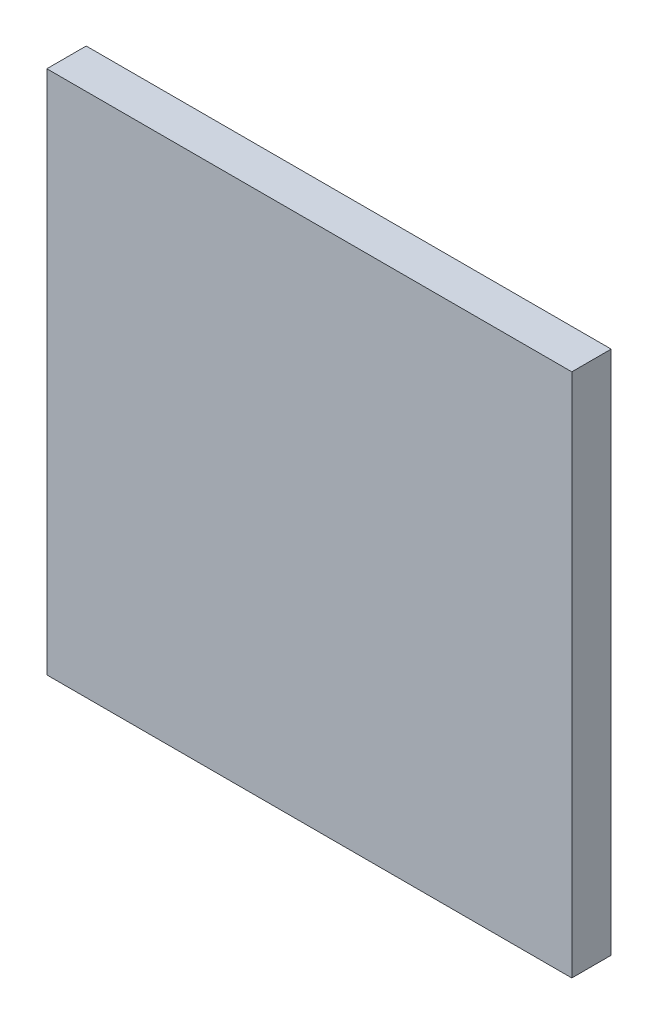
ISO-10303-21;
HEADER;
FILE_DESCRIPTION(('STEP AP214'),'2;1');
FILE_NAME('part.step','',(''),(''),'','','');
FILE_SCHEMA(('AUTOMOTIVE_DESIGN { 1 0 10303 214 1 1 1 1 }'));
ENDSEC;
DATA;
#1=APPLICATION_CONTEXT('core data for automotive mechanical design processes');
#2=APPLICATION_PROTOCOL_DEFINITION('international standard','automotive_design',2000,#1);
#3=PRODUCT_CONTEXT('',#1,'mechanical');
#4=PRODUCT('Part','Part','',(#3));
#5=PRODUCT_RELATED_PRODUCT_CATEGORY('part','',(#4));
#6=PRODUCT_DEFINITION_FORMATION('','',#4);
#7=PRODUCT_DEFINITION_CONTEXT('part definition',#1,'design');
#8=PRODUCT_DEFINITION('design','',#6,#7);
#9=PRODUCT_DEFINITION_SHAPE('','',#8);
#10=(LENGTH_UNIT() NAMED_UNIT(*) SI_UNIT(.MILLI.,.METRE.));
#11=(NAMED_UNIT(*) PLANE_ANGLE_UNIT() SI_UNIT($,.RADIAN.));
#12=(NAMED_UNIT(*) SI_UNIT($,.STERADIAN.) SOLID_ANGLE_UNIT());
#13=UNCERTAINTY_MEASURE_WITH_UNIT(LENGTH_MEASURE(1.E-05),#10,'distance_accuracy_value','');
#14=(GEOMETRIC_REPRESENTATION_CONTEXT(3) GLOBAL_UNCERTAINTY_ASSIGNED_CONTEXT((#13)) GLOBAL_UNIT_ASSIGNED_CONTEXT((#10,
#11,#12)) REPRESENTATION_CONTEXT('',''));
#15=CARTESIAN_POINT('',(0.,0.,0.));
#16=DIRECTION('',(0.,0.,1.));
#17=DIRECTION('',(1.,0.,0.));
#18=AXIS2_PLACEMENT_3D('',#15,#16,#17);
#19=CARTESIAN_POINT('',(-7.00000124,-7.00000124,1.05));
#20=DIRECTION('',(0.,0.,1.));
#21=DIRECTION('',(1.,0.,0.));
#22=AXIS2_PLACEMENT_3D('',#19,#20,#21);
#23=PLANE('',#22);
#24=DIRECTION('',(0.,1.,0.));
#25=VECTOR('',#24,1.);
#26=CARTESIAN_POINT('',(7.00000124,7.00000124,1.05));
#27=LINE('',#26,#25);
#28=CARTESIAN_POINT('',(7.00000124,7.00000124,1.05));
#29=VERTEX_POINT('',#28);
#30=CARTESIAN_POINT('',(7.00000124,-7.00000124,1.05));
#31=VERTEX_POINT('',#30);
#32=EDGE_CURVE('E58',#29,#31,#27,.F.);
#33=ORIENTED_EDGE('',*,*,#32,.F.);
#34=DIRECTION('',(1.,0.,0.));
#35=VECTOR('',#34,1.);
#36=CARTESIAN_POINT('',(-7.00000124,7.00000124,1.05));
#37=LINE('',#36,#35);
#38=CARTESIAN_POINT('',(-7.00000124,7.00000124,1.05));
#39=VERTEX_POINT('',#38);
#40=EDGE_CURVE('E53',#39,#29,#37,.T.);
#41=ORIENTED_EDGE('',*,*,#40,.F.);
#42=DIRECTION('',(0.,1.,0.));
#43=VECTOR('',#42,1.);
#44=CARTESIAN_POINT('',(-7.00000124,-7.00000124,1.05));
#45=LINE('',#44,#43);
#46=CARTESIAN_POINT('',(-7.00000124,-7.00000124,1.05));
#47=VERTEX_POINT('',#46);
#48=EDGE_CURVE('E68',#47,#39,#45,.T.);
#49=ORIENTED_EDGE('',*,*,#48,.F.);
#50=DIRECTION('',(1.,0.,0.));
#51=VECTOR('',#50,1.);
#52=CARTESIAN_POINT('',(7.00000124,-7.00000124,1.05));
#53=LINE('',#52,#51);
#54=EDGE_CURVE('E20',#31,#47,#53,.F.);
#55=ORIENTED_EDGE('',*,*,#54,.F.);
#56=EDGE_LOOP('',(#33,#41,#49,#55));
#57=FACE_BOUND('',#56,.T.);
#58=ADVANCED_FACE('F17',(#57),#23,.T.);
#59=CARTESIAN_POINT('',(7.00000124,-7.00000124,0.));
#60=DIRECTION('',(0.,-1.,0.));
#61=DIRECTION('',(0.,0.,-1.));
#62=AXIS2_PLACEMENT_3D('',#59,#60,#61);
#63=PLANE('',#62);
#64=DIRECTION('',(0.,0.,1.));
#65=VECTOR('',#64,1.);
#66=CARTESIAN_POINT('',(-7.00000124,-7.00000124,0.));
#67=LINE('',#66,#65);
#68=CARTESIAN_POINT('',(-7.00000124,-7.00000124,0.));
#69=VERTEX_POINT('',#68);
#70=EDGE_CURVE('E79',#69,#47,#67,.T.);
#71=ORIENTED_EDGE('',*,*,#70,.F.);
#72=DIRECTION('',(1.,0.,0.));
#73=VECTOR('',#72,1.);
#74=CARTESIAN_POINT('',(-7.00000124,-7.00000124,0.));
#75=LINE('',#74,#73);
#76=CARTESIAN_POINT('',(7.00000124,-7.00000124,0.));
#77=VERTEX_POINT('',#76);
#78=EDGE_CURVE('E74',#69,#77,#75,.T.);
#79=ORIENTED_EDGE('',*,*,#78,.T.);
#80=DIRECTION('',(0.,0.,-1.));
#81=VECTOR('',#80,1.);
#82=CARTESIAN_POINT('',(7.00000124,-7.00000124,0.));
#83=LINE('',#82,#81);
#84=EDGE_CURVE('E63',#31,#77,#83,.T.);
#85=ORIENTED_EDGE('',*,*,#84,.F.);
#86=ORIENTED_EDGE('',*,*,#54,.T.);
#87=EDGE_LOOP('',(#71,#79,#85,#86));
#88=FACE_BOUND('',#87,.T.);
#89=ADVANCED_FACE('F73',(#88),#63,.T.);
#90=CARTESIAN_POINT('',(7.00000124,7.00000124,0.));
#91=DIRECTION('',(1.,0.,0.));
#92=DIRECTION('',(0.,0.,-1.));
#93=AXIS2_PLACEMENT_3D('',#90,#91,#92);
#94=PLANE('',#93);
#95=ORIENTED_EDGE('',*,*,#84,.T.);
#96=DIRECTION('',(0.,1.,0.));
#97=VECTOR('',#96,1.);
#98=CARTESIAN_POINT('',(7.00000124,-7.00000124,0.));
#99=LINE('',#98,#97);
#100=CARTESIAN_POINT('',(7.00000124,7.00000124,0.));
#101=VERTEX_POINT('',#100);
#102=EDGE_CURVE('E84',#77,#101,#99,.T.);
#103=ORIENTED_EDGE('',*,*,#102,.T.);
#104=DIRECTION('',(0.,0.,1.));
#105=VECTOR('',#104,1.);
#106=CARTESIAN_POINT('',(7.00000124,7.00000124,0.));
#107=LINE('',#106,#105);
#108=EDGE_CURVE('E65',#29,#101,#107,.F.);
#109=ORIENTED_EDGE('',*,*,#108,.F.);
#110=ORIENTED_EDGE('',*,*,#32,.T.);
#111=EDGE_LOOP('',(#95,#103,#109,#110));
#112=FACE_BOUND('',#111,.T.);
#113=ADVANCED_FACE('F60',(#112),#94,.T.);
#114=CARTESIAN_POINT('',(-7.00000124,7.00000124,0.));
#115=DIRECTION('',(0.,1.,0.));
#116=DIRECTION('',(0.,0.,1.));
#117=AXIS2_PLACEMENT_3D('',#114,#115,#116);
#118=PLANE('',#117);
#119=ORIENTED_EDGE('',*,*,#108,.T.);
#120=DIRECTION('',(1.,0.,0.));
#121=VECTOR('',#120,1.);
#122=CARTESIAN_POINT('',(-7.00000124,7.00000124,0.));
#123=LINE('',#122,#121);
#124=CARTESIAN_POINT('',(-7.00000124,7.00000124,0.));
#125=VERTEX_POINT('',#124);
#126=EDGE_CURVE('E26',#101,#125,#123,.F.);
#127=ORIENTED_EDGE('',*,*,#126,.T.);
#128=DIRECTION('',(0.,0.,1.));
#129=VECTOR('',#128,1.);
#130=CARTESIAN_POINT('',(-7.00000124,7.00000124,0.));
#131=LINE('',#130,#129);
#132=EDGE_CURVE('E34',#39,#125,#131,.F.);
#133=ORIENTED_EDGE('',*,*,#132,.F.);
#134=ORIENTED_EDGE('',*,*,#40,.T.);
#135=EDGE_LOOP('',(#119,#127,#133,#134));
#136=FACE_BOUND('',#135,.T.);
#137=ADVANCED_FACE('F88',(#136),#118,.T.);
#138=CARTESIAN_POINT('',(-7.00000124,-7.00000124,0.));
#139=DIRECTION('',(-1.,0.,0.));
#140=DIRECTION('',(0.,0.,1.));
#141=AXIS2_PLACEMENT_3D('',#138,#139,#140);
#142=PLANE('',#141);
#143=ORIENTED_EDGE('',*,*,#132,.T.);
#144=DIRECTION('',(0.,1.,0.));
#145=VECTOR('',#144,1.);
#146=CARTESIAN_POINT('',(-7.00000124,-7.00000124,0.));
#147=LINE('',#146,#145);
#148=EDGE_CURVE('E11',#125,#69,#147,.F.);
#149=ORIENTED_EDGE('',*,*,#148,.T.);
#150=ORIENTED_EDGE('',*,*,#70,.T.);
#151=ORIENTED_EDGE('',*,*,#48,.T.);
#152=EDGE_LOOP('',(#143,#149,#150,#151));
#153=FACE_BOUND('',#152,.T.);
#154=ADVANCED_FACE('F91',(#153),#142,.T.);
#155=CARTESIAN_POINT('',(-7.00000124,-7.00000124,0.));
#156=DIRECTION('',(0.,0.,1.));
#157=DIRECTION('',(1.,0.,0.));
#158=AXIS2_PLACEMENT_3D('',#155,#156,#157);
#159=PLANE('',#158);
#160=ORIENTED_EDGE('',*,*,#126,.F.);
#161=ORIENTED_EDGE('',*,*,#102,.F.);
#162=ORIENTED_EDGE('',*,*,#78,.F.);
#163=ORIENTED_EDGE('',*,*,#148,.F.);
#164=EDGE_LOOP('',(#160,#161,#162,#163));
#165=FACE_BOUND('',#164,.T.);
#166=ADVANCED_FACE('F90',(#165),#159,.F.);
#167=CLOSED_SHELL('',(#58,#89,#113,#137,#154,#166));
#168=MANIFOLD_SOLID_BREP('B1',#167);
#169=ADVANCED_BREP_SHAPE_REPRESENTATION('',(#18,#168),#14);
#170=SHAPE_DEFINITION_REPRESENTATION(#9,#169);
ENDSEC;
END-ISO-10303-21;
